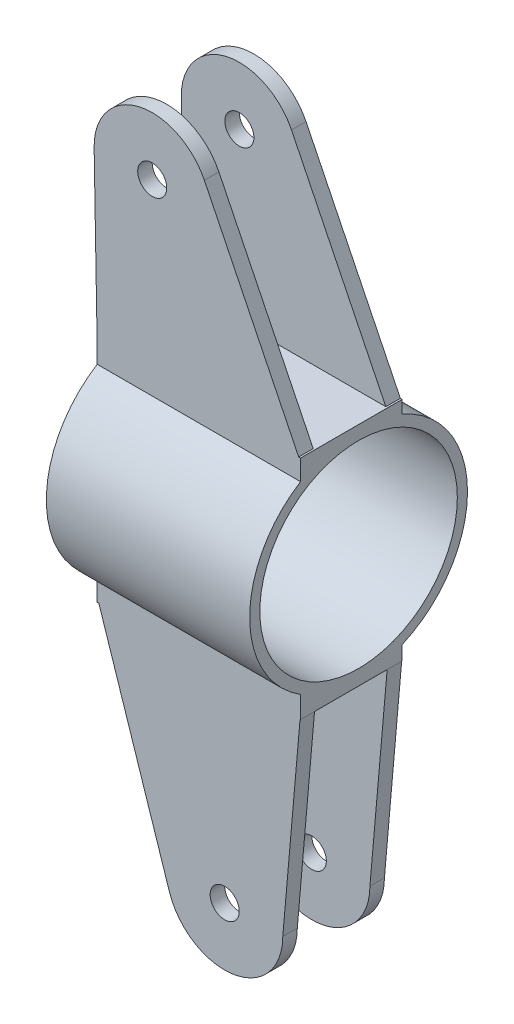
ISO-10303-21;
HEADER;
FILE_DESCRIPTION(('STEP AP214'),'2;1');
FILE_NAME('part.step','',(''),(''),'','','');
FILE_SCHEMA(('AUTOMOTIVE_DESIGN { 1 0 10303 214 1 1 1 1 }'));
ENDSEC;
DATA;
#1=APPLICATION_CONTEXT('core data for automotive mechanical design processes');
#2=APPLICATION_PROTOCOL_DEFINITION('international standard','automotive_design',2000,#1);
#3=PRODUCT_CONTEXT('',#1,'mechanical');
#4=PRODUCT('Part','Part','',(#3));
#5=PRODUCT_RELATED_PRODUCT_CATEGORY('part','',(#4));
#6=PRODUCT_DEFINITION_FORMATION('','',#4);
#7=PRODUCT_DEFINITION_CONTEXT('part definition',#1,'design');
#8=PRODUCT_DEFINITION('design','',#6,#7);
#9=PRODUCT_DEFINITION_SHAPE('','',#8);
#10=(LENGTH_UNIT() NAMED_UNIT(*) SI_UNIT(.MILLI.,.METRE.));
#11=(NAMED_UNIT(*) PLANE_ANGLE_UNIT() SI_UNIT($,.RADIAN.));
#12=(NAMED_UNIT(*) SI_UNIT($,.STERADIAN.) SOLID_ANGLE_UNIT());
#13=UNCERTAINTY_MEASURE_WITH_UNIT(LENGTH_MEASURE(1.E-05),#10,'distance_accuracy_value','');
#14=(GEOMETRIC_REPRESENTATION_CONTEXT(3) GLOBAL_UNCERTAINTY_ASSIGNED_CONTEXT((#13)) GLOBAL_UNIT_ASSIGNED_CONTEXT((#10,
#11,#12)) REPRESENTATION_CONTEXT('',''));
#15=CARTESIAN_POINT('',(0.,0.,0.));
#16=DIRECTION('',(0.,0.,1.));
#17=DIRECTION('',(1.,0.,0.));
#18=AXIS2_PLACEMENT_3D('',#15,#16,#17);
#19=CARTESIAN_POINT('',(70.796890518674,-39.2325936170341,-15.));
#20=DIRECTION('',(0.,-1.,0.));
#21=DIRECTION('',(0.,0.,-1.));
#22=AXIS2_PLACEMENT_3D('',#19,#20,#21);
#23=PLANE('',#22);
#24=DIRECTION('',(-1.,0.,0.));
#25=VECTOR('',#24,1.);
#26=CARTESIAN_POINT('',(70.796890518674,-39.2325936170341,-10.));
#27=LINE('',#26,#25);
#28=CARTESIAN_POINT('',(34.8477719876476,-39.2325936170341,-10.));
#29=VERTEX_POINT('',#28);
#30=CARTESIAN_POINT('',(-34.4302129102219,-39.2325936170341,-10.));
#31=VERTEX_POINT('',#30);
#32=EDGE_CURVE('E350',#29,#31,#27,.T.);
#33=ORIENTED_EDGE('',*,*,#32,.F.);
#34=DIRECTION('',(0.,0.,-1.));
#35=VECTOR('',#34,1.);
#36=CARTESIAN_POINT('',(34.8477719876476,-39.2325936170341,-15.));
#37=LINE('',#36,#35);
#38=CARTESIAN_POINT('',(34.8477719876476,-39.2325936170341,-15.));
#39=VERTEX_POINT('',#38);
#40=EDGE_CURVE('E347',#29,#39,#37,.T.);
#41=ORIENTED_EDGE('',*,*,#40,.T.);
#42=DIRECTION('',(-1.,0.,0.));
#43=VECTOR('',#42,1.);
#44=CARTESIAN_POINT('',(70.796890518674,-39.2325936170341,-15.));
#45=LINE('',#44,#43);
#46=CARTESIAN_POINT('',(35.,-39.2325936170341,-15.));
#47=VERTEX_POINT('',#46);
#48=EDGE_CURVE('E369',#47,#39,#45,.T.);
#49=ORIENTED_EDGE('',*,*,#48,.F.);
#50=DIRECTION('',(0.,0.,1.));
#51=VECTOR('',#50,1.);
#52=CARTESIAN_POINT('',(35.,-39.2325936170341,-15.));
#53=LINE('',#52,#51);
#54=CARTESIAN_POINT('',(35.,-39.2325936170341,20.));
#55=VERTEX_POINT('',#54);
#56=EDGE_CURVE('E366',#47,#55,#53,.T.);
#57=ORIENTED_EDGE('',*,*,#56,.T.);
#58=DIRECTION('',(-1.,0.,0.));
#59=VECTOR('',#58,1.);
#60=CARTESIAN_POINT('',(70.796890518674,-39.2325936170341,20.));
#61=LINE('',#60,#59);
#62=CARTESIAN_POINT('',(34.8477719876476,-39.2325936170341,20.));
#63=VERTEX_POINT('',#62);
#64=EDGE_CURVE('E365',#55,#63,#61,.T.);
#65=ORIENTED_EDGE('',*,*,#64,.T.);
#66=DIRECTION('',(0.,0.,1.));
#67=VECTOR('',#66,1.);
#68=CARTESIAN_POINT('',(34.8477719876476,-39.2325936170341,20.));
#69=LINE('',#68,#67);
#70=CARTESIAN_POINT('',(34.8477719876476,-39.2325936170341,15.));
#71=VERTEX_POINT('',#70);
#72=EDGE_CURVE('E381',#71,#63,#69,.T.);
#73=ORIENTED_EDGE('',*,*,#72,.F.);
#74=DIRECTION('',(1.,0.,0.));
#75=VECTOR('',#74,1.);
#76=CARTESIAN_POINT('',(8.89703954959997,-39.2325936170341,15.));
#77=LINE('',#76,#75);
#78=CARTESIAN_POINT('',(-34.4302129102219,-39.2325936170341,15.));
#79=VERTEX_POINT('',#78);
#80=EDGE_CURVE('E378',#79,#71,#77,.T.);
#81=ORIENTED_EDGE('',*,*,#80,.F.);
#82=DIRECTION('',(0.,0.,-1.));
#83=VECTOR('',#82,1.);
#84=CARTESIAN_POINT('',(-34.4302129102219,-39.2325936170341,20.));
#85=LINE('',#84,#83);
#86=CARTESIAN_POINT('',(-34.4302129102219,-39.2325936170341,20.));
#87=VERTEX_POINT('',#86);
#88=EDGE_CURVE('E11',#87,#79,#85,.T.);
#89=ORIENTED_EDGE('',*,*,#88,.F.);
#90=CARTESIAN_POINT('',(-35.,-39.2325936170341,20.));
#91=VERTEX_POINT('',#90);
#92=EDGE_CURVE('E62',#87,#91,#61,.T.);
#93=ORIENTED_EDGE('',*,*,#92,.T.);
#94=DIRECTION('',(0.,0.,1.));
#95=VECTOR('',#94,1.);
#96=CARTESIAN_POINT('',(-35.,-39.2325936170341,-15.));
#97=LINE('',#96,#95);
#98=CARTESIAN_POINT('',(-35.,-39.2325936170341,-15.));
#99=VERTEX_POINT('',#98);
#100=EDGE_CURVE('E356',#99,#91,#97,.T.);
#101=ORIENTED_EDGE('',*,*,#100,.F.);
#102=CARTESIAN_POINT('',(-34.4302129102219,-39.2325936170341,-15.));
#103=VERTEX_POINT('',#102);
#104=EDGE_CURVE('E361',#103,#99,#45,.T.);
#105=ORIENTED_EDGE('',*,*,#104,.F.);
#106=DIRECTION('',(0.,0.,1.));
#107=VECTOR('',#106,1.);
#108=CARTESIAN_POINT('',(-34.4302129102219,-39.2325936170341,-15.));
#109=LINE('',#108,#107);
#110=EDGE_CURVE('E344',#103,#31,#109,.T.);
#111=ORIENTED_EDGE('',*,*,#110,.T.);
#112=EDGE_LOOP('',(#33,#41,#49,#57,#65,#73,#81,#89,#93,#101,#105,#111));
#113=FACE_BOUND('',#112,.T.);
#114=ADVANCED_FACE('F39',(#113),#23,.T.);
#115=CARTESIAN_POINT('',(8.89703954959997,-106.961265098147,20.));
#116=DIRECTION('',(0.,0.,1.));
#117=DIRECTION('',(1.,0.,0.));
#118=AXIS2_PLACEMENT_3D('',#115,#116,#117);
#119=PLANE('',#118);
#120=DIRECTION('',(0.0875241718788062,0.996162396066489,0.));
#121=VECTOR('',#120,1.);
#122=CARTESIAN_POINT('',(35.,-37.5,20.));
#123=LINE('',#122,#121);
#124=CARTESIAN_POINT('',(28.8970395496,-106.961265098147,20.));
#125=VERTEX_POINT('',#124);
#126=EDGE_CURVE('E391',#125,#63,#123,.T.);
#127=ORIENTED_EDGE('',*,*,#126,.T.);
#128=ORIENTED_EDGE('',*,*,#64,.F.);
#129=DIRECTION('',(0.,1.,0.));
#130=VECTOR('',#129,1.);
#131=CARTESIAN_POINT('',(35.,-31.7214438511238,20.));
#132=LINE('',#131,#130);
#133=CARTESIAN_POINT('',(35.,-31.7214438511238,20.));
#134=VERTEX_POINT('',#133);
#135=EDGE_CURVE('E362',#55,#134,#132,.T.);
#136=ORIENTED_EDGE('',*,*,#135,.T.);
#137=DIRECTION('',(-1.,0.,0.));
#138=VECTOR('',#137,1.);
#139=CARTESIAN_POINT('',(70.796890518674,-31.7214438511238,20.));
#140=LINE('',#139,#138);
#141=CARTESIAN_POINT('',(-35.,-31.7214438511238,20.));
#142=VERTEX_POINT('',#141);
#143=EDGE_CURVE('E364',#134,#142,#140,.T.);
#144=ORIENTED_EDGE('',*,*,#143,.T.);
#145=DIRECTION('',(0.,1.,0.));
#146=VECTOR('',#145,1.);
#147=CARTESIAN_POINT('',(-35.,-31.7214438511238,20.));
#148=LINE('',#147,#146);
#149=EDGE_CURVE('E353',#91,#142,#148,.T.);
#150=ORIENTED_EDGE('',*,*,#149,.F.);
#151=ORIENTED_EDGE('',*,*,#92,.F.);
#152=DIRECTION('',(0.312403839167412,-0.949949388795773,0.));
#153=VECTOR('',#152,1.);
#154=CARTESIAN_POINT('',(-35.,-37.5,20.));
#155=LINE('',#154,#153);
#156=CARTESIAN_POINT('',(-10.1019482263155,-113.209341881495,20.));
#157=VERTEX_POINT('',#156);
#158=EDGE_CURVE('E394',#87,#157,#155,.T.);
#159=ORIENTED_EDGE('',*,*,#158,.T.);
#160=CARTESIAN_POINT('',(8.89703954959997,-106.961265098147,20.));
#161=DIRECTION('',(0.,0.,1.));
#162=DIRECTION('',(1.,0.,0.));
#163=AXIS2_PLACEMENT_3D('',#160,#161,#162);
#164=CIRCLE('',#163,20.);
#165=EDGE_CURVE('E397',#157,#125,#164,.T.);
#166=ORIENTED_EDGE('',*,*,#165,.T.);
#167=EDGE_LOOP('',(#127,#128,#136,#144,#150,#151,#159,#166));
#168=FACE_BOUND('',#167,.T.);
#169=CARTESIAN_POINT('',(8.89703954959997,-106.961265098147,20.));
#170=DIRECTION('',(0.,0.,1.));
#171=DIRECTION('',(1.,0.,0.));
#172=AXIS2_PLACEMENT_3D('',#169,#170,#171);
#173=CIRCLE('',#172,5.);
#174=CARTESIAN_POINT('',(13.8970395496,-106.961265098147,20.));
#175=VERTEX_POINT('',#174);
#176=EDGE_CURVE('E385',#175,#175,#173,.T.);
#177=ORIENTED_EDGE('',*,*,#176,.F.);
#178=EDGE_LOOP('',(#177));
#179=FACE_BOUND('',#178,.T.);
#180=ADVANCED_FACE('F423',(#168,#179),#119,.T.);
#181=CARTESIAN_POINT('',(8.89703954959997,-106.961265098147,15.));
#182=DIRECTION('',(0.,0.,1.));
#183=DIRECTION('',(1.,0.,0.));
#184=AXIS2_PLACEMENT_3D('',#181,#182,#183);
#185=PLANE('',#184);
#186=DIRECTION('',(0.312403839167412,-0.949949388795773,0.));
#187=VECTOR('',#186,1.);
#188=CARTESIAN_POINT('',(-35.,-37.5,15.));
#189=LINE('',#188,#187);
#190=CARTESIAN_POINT('',(-10.1019482263155,-113.209341881495,15.));
#191=VERTEX_POINT('',#190);
#192=EDGE_CURVE('E402',#79,#191,#189,.T.);
#193=ORIENTED_EDGE('',*,*,#192,.F.);
#194=ORIENTED_EDGE('',*,*,#80,.T.);
#195=DIRECTION('',(0.0875241718788062,0.996162396066489,0.));
#196=VECTOR('',#195,1.);
#197=CARTESIAN_POINT('',(35.,-37.5,15.));
#198=LINE('',#197,#196);
#199=CARTESIAN_POINT('',(28.8970395496,-106.961265098147,15.));
#200=VERTEX_POINT('',#199);
#201=EDGE_CURVE('E388',#200,#71,#198,.T.);
#202=ORIENTED_EDGE('',*,*,#201,.F.);
#203=CARTESIAN_POINT('',(8.89703954959997,-106.961265098147,15.));
#204=DIRECTION('',(0.,0.,1.));
#205=DIRECTION('',(1.,0.,0.));
#206=AXIS2_PLACEMENT_3D('',#203,#204,#205);
#207=CIRCLE('',#206,20.);
#208=EDGE_CURVE('E395',#191,#200,#207,.T.);
#209=ORIENTED_EDGE('',*,*,#208,.F.);
#210=EDGE_LOOP('',(#193,#194,#202,#209));
#211=FACE_BOUND('',#210,.T.);
#212=CARTESIAN_POINT('',(8.89703954959997,-106.961265098147,15.));
#213=DIRECTION('',(0.,0.,1.));
#214=DIRECTION('',(1.,0.,0.));
#215=AXIS2_PLACEMENT_3D('',#212,#213,#214);
#216=CIRCLE('',#215,5.);
#217=CARTESIAN_POINT('',(13.8970395496,-106.961265098147,15.));
#218=VERTEX_POINT('',#217);
#219=EDGE_CURVE('E384',#218,#218,#216,.T.);
#220=ORIENTED_EDGE('',*,*,#219,.T.);
#221=EDGE_LOOP('',(#220));
#222=FACE_BOUND('',#221,.T.);
#223=ADVANCED_FACE('F418',(#211,#222),#185,.F.);
#224=CARTESIAN_POINT('',(35.,-37.5,20.));
#225=DIRECTION('',(-0.996162396066489,0.0875241718788063,0.));
#226=DIRECTION('',(-0.0875241718788063,-0.996162396066489,0.));
#227=AXIS2_PLACEMENT_3D('',#224,#225,#226);
#228=PLANE('',#227);
#229=ORIENTED_EDGE('',*,*,#201,.T.);
#230=ORIENTED_EDGE('',*,*,#72,.T.);
#231=ORIENTED_EDGE('',*,*,#126,.F.);
#232=DIRECTION('',(0.,0.,-1.));
#233=VECTOR('',#232,1.);
#234=CARTESIAN_POINT('',(28.8970395496,-106.961265098147,20.));
#235=LINE('',#234,#233);
#236=EDGE_CURVE('E399',#125,#200,#235,.T.);
#237=ORIENTED_EDGE('',*,*,#236,.T.);
#238=EDGE_LOOP('',(#229,#230,#231,#237));
#239=FACE_BOUND('',#238,.T.);
#240=ADVANCED_FACE('F41',(#239),#228,.F.);
#241=CARTESIAN_POINT('',(-35.,-37.5,20.));
#242=DIRECTION('',(0.949949388795773,0.312403839167412,0.));
#243=DIRECTION('',(-0.312403839167412,0.949949388795773,0.));
#244=AXIS2_PLACEMENT_3D('',#241,#242,#243);
#245=PLANE('',#244);
#246=ORIENTED_EDGE('',*,*,#158,.F.);
#247=ORIENTED_EDGE('',*,*,#88,.T.);
#248=ORIENTED_EDGE('',*,*,#192,.T.);
#249=DIRECTION('',(0.,0.,-1.));
#250=VECTOR('',#249,1.);
#251=CARTESIAN_POINT('',(-10.1019482263155,-113.209341881495,20.));
#252=LINE('',#251,#250);
#253=EDGE_CURVE('E47',#157,#191,#252,.T.);
#254=ORIENTED_EDGE('',*,*,#253,.F.);
#255=EDGE_LOOP('',(#246,#247,#248,#254));
#256=FACE_BOUND('',#255,.T.);
#257=ADVANCED_FACE('F425',(#256),#245,.F.);
#258=CARTESIAN_POINT('',(8.89703954959997,-106.961265098147,20.));
#259=DIRECTION('',(0.,0.,-1.));
#260=DIRECTION('',(-1.,0.,0.));
#261=AXIS2_PLACEMENT_3D('',#258,#259,#260);
#262=CYLINDRICAL_SURFACE('',#261,20.);
#263=ORIENTED_EDGE('',*,*,#208,.T.);
#264=ORIENTED_EDGE('',*,*,#236,.F.);
#265=ORIENTED_EDGE('',*,*,#165,.F.);
#266=ORIENTED_EDGE('',*,*,#253,.T.);
#267=EDGE_LOOP('',(#263,#264,#265,#266));
#268=FACE_BOUND('',#267,.T.);
#269=ADVANCED_FACE('F411',(#268),#262,.T.);
#270=CARTESIAN_POINT('',(8.89703954959997,-106.961265098147,20.));
#271=DIRECTION('',(0.,0.,-1.));
#272=DIRECTION('',(-1.,0.,0.));
#273=AXIS2_PLACEMENT_3D('',#270,#271,#272);
#274=CYLINDRICAL_SURFACE('',#273,5.);
#275=ORIENTED_EDGE('',*,*,#176,.T.);
#276=EDGE_LOOP('',(#275));
#277=FACE_BOUND('',#276,.T.);
#278=ORIENTED_EDGE('',*,*,#219,.F.);
#279=EDGE_LOOP('',(#278));
#280=FACE_BOUND('',#279,.T.);
#281=ADVANCED_FACE('F519',(#277,#280),#274,.F.);
#282=CARTESIAN_POINT('',(35.,0.,0.));
#283=DIRECTION('',(1.,0.,0.));
#284=DIRECTION('',(0.,0.,-1.));
#285=AXIS2_PLACEMENT_3D('',#282,#283,#284);
#286=PLANE('',#285);
#287=ORIENTED_EDGE('',*,*,#56,.F.);
#288=DIRECTION('',(0.,-1.,0.));
#289=VECTOR('',#288,1.);
#290=CARTESIAN_POINT('',(35.,-34.3693177121688,-15.));
#291=LINE('',#290,#289);
#292=CARTESIAN_POINT('',(35.,-34.3693177121688,-15.));
#293=VERTEX_POINT('',#292);
#294=EDGE_CURVE('E355',#293,#47,#291,.T.);
#295=ORIENTED_EDGE('',*,*,#294,.F.);
#296=CARTESIAN_POINT('',(35.,0.,0.));
#297=DIRECTION('',(1.,0.,0.));
#298=DIRECTION('',(0.,0.,-1.));
#299=AXIS2_PLACEMENT_3D('',#296,#297,#298);
#300=CIRCLE('',#299,37.5);
#301=CARTESIAN_POINT('',(35.,34.3693177121688,-15.));
#302=VERTEX_POINT('',#301);
#303=EDGE_CURVE('E311',#293,#302,#300,.T.);
#304=ORIENTED_EDGE('',*,*,#303,.T.);
#305=DIRECTION('',(0.,1.,0.));
#306=VECTOR('',#305,1.);
#307=CARTESIAN_POINT('',(35.,37.5,-15.));
#308=LINE('',#307,#306);
#309=CARTESIAN_POINT('',(35.,38.7567278217142,-15.));
#310=VERTEX_POINT('',#309);
#311=EDGE_CURVE('E286',#302,#310,#308,.T.);
#312=ORIENTED_EDGE('',*,*,#311,.T.);
#313=DIRECTION('',(0.,0.,1.));
#314=VECTOR('',#313,1.);
#315=CARTESIAN_POINT('',(35.,38.7567278217142,20.));
#316=LINE('',#315,#314);
#317=CARTESIAN_POINT('',(35.,38.7567278217142,20.));
#318=VERTEX_POINT('',#317);
#319=EDGE_CURVE('E273',#310,#318,#316,.T.);
#320=ORIENTED_EDGE('',*,*,#319,.T.);
#321=DIRECTION('',(0.,-1.,0.));
#322=VECTOR('',#321,1.);
#323=CARTESIAN_POINT('',(35.,37.5,20.));
#324=LINE('',#323,#322);
#325=CARTESIAN_POINT('',(35.,31.7214438511238,20.));
#326=VERTEX_POINT('',#325);
#327=EDGE_CURVE('E284',#318,#326,#324,.T.);
#328=ORIENTED_EDGE('',*,*,#327,.T.);
#329=EDGE_CURVE('E307',#326,#134,#300,.T.);
#330=ORIENTED_EDGE('',*,*,#329,.T.);
#331=ORIENTED_EDGE('',*,*,#135,.F.);
#332=EDGE_LOOP('',(#287,#295,#304,#312,#320,#328,#330,#331));
#333=FACE_BOUND('',#332,.T.);
#334=CARTESIAN_POINT('',(35.,0.,0.));
#335=DIRECTION('',(1.,0.,0.));
#336=DIRECTION('',(0.,0.,-1.));
#337=AXIS2_PLACEMENT_3D('',#334,#335,#336);
#338=CIRCLE('',#337,34.);
#339=CARTESIAN_POINT('',(35.,0.,-34.));
#340=VERTEX_POINT('',#339);
#341=EDGE_CURVE('E301',#340,#340,#338,.T.);
#342=ORIENTED_EDGE('',*,*,#341,.F.);
#343=EDGE_LOOP('',(#342));
#344=FACE_BOUND('',#343,.T.);
#345=ADVANCED_FACE('F433',(#333,#344),#286,.T.);
#346=CARTESIAN_POINT('',(-35.,0.,0.));
#347=DIRECTION('',(-1.,0.,0.));
#348=DIRECTION('',(0.,0.,1.));
#349=AXIS2_PLACEMENT_3D('',#346,#347,#348);
#350=PLANE('',#349);
#351=DIRECTION('',(0.,-1.,0.));
#352=VECTOR('',#351,1.);
#353=CARTESIAN_POINT('',(-35.,-34.3693177121688,-15.));
#354=LINE('',#353,#352);
#355=CARTESIAN_POINT('',(-35.,-34.3693177121688,-15.));
#356=VERTEX_POINT('',#355);
#357=EDGE_CURVE('E352',#356,#99,#354,.T.);
#358=ORIENTED_EDGE('',*,*,#357,.T.);
#359=ORIENTED_EDGE('',*,*,#100,.T.);
#360=ORIENTED_EDGE('',*,*,#149,.T.);
#361=CARTESIAN_POINT('',(-35.,0.,0.));
#362=DIRECTION('',(1.,0.,0.));
#363=DIRECTION('',(0.,0.,-1.));
#364=AXIS2_PLACEMENT_3D('',#361,#362,#363);
#365=CIRCLE('',#364,37.5);
#366=CARTESIAN_POINT('',(-35.,31.7214438511238,20.));
#367=VERTEX_POINT('',#366);
#368=EDGE_CURVE('E312',#367,#142,#365,.T.);
#369=ORIENTED_EDGE('',*,*,#368,.F.);
#370=DIRECTION('',(0.,1.,0.));
#371=VECTOR('',#370,1.);
#372=CARTESIAN_POINT('',(-35.,37.5,20.));
#373=LINE('',#372,#371);
#374=CARTESIAN_POINT('',(-35.,37.5,20.));
#375=VERTEX_POINT('',#374);
#376=EDGE_CURVE('E274',#367,#375,#373,.T.);
#377=ORIENTED_EDGE('',*,*,#376,.T.);
#378=DIRECTION('',(0.,0.,-1.));
#379=VECTOR('',#378,1.);
#380=CARTESIAN_POINT('',(-35.,37.5,20.));
#381=LINE('',#380,#379);
#382=CARTESIAN_POINT('',(-35.,37.5,15.));
#383=VERTEX_POINT('',#382);
#384=EDGE_CURVE('E257',#375,#383,#381,.T.);
#385=ORIENTED_EDGE('',*,*,#384,.T.);
#386=DIRECTION('',(0.,-1.,0.));
#387=VECTOR('',#386,1.);
#388=CARTESIAN_POINT('',(-35.,0.,15.));
#389=LINE('',#388,#387);
#390=CARTESIAN_POINT('',(-35.,38.7567278217142,15.));
#391=VERTEX_POINT('',#390);
#392=EDGE_CURVE('E271',#391,#383,#389,.T.);
#393=ORIENTED_EDGE('',*,*,#392,.F.);
#394=DIRECTION('',(0.,0.,-1.));
#395=VECTOR('',#394,1.);
#396=CARTESIAN_POINT('',(-35.,38.7567278217142,20.));
#397=LINE('',#396,#395);
#398=CARTESIAN_POINT('',(-35.,38.7567278217142,-10.));
#399=VERTEX_POINT('',#398);
#400=EDGE_CURVE('E281',#391,#399,#397,.T.);
#401=ORIENTED_EDGE('',*,*,#400,.T.);
#402=DIRECTION('',(0.,-1.,0.));
#403=VECTOR('',#402,1.);
#404=CARTESIAN_POINT('',(-35.,0.,-10.));
#405=LINE('',#404,#403);
#406=CARTESIAN_POINT('',(-35.,37.5,-10.));
#407=VERTEX_POINT('',#406);
#408=EDGE_CURVE('E240',#399,#407,#405,.T.);
#409=ORIENTED_EDGE('',*,*,#408,.T.);
#410=DIRECTION('',(0.,0.,-1.));
#411=VECTOR('',#410,1.);
#412=CARTESIAN_POINT('',(-35.,37.5,-10.));
#413=LINE('',#412,#411);
#414=CARTESIAN_POINT('',(-35.,37.5,-15.));
#415=VERTEX_POINT('',#414);
#416=EDGE_CURVE('E226',#407,#415,#413,.T.);
#417=ORIENTED_EDGE('',*,*,#416,.T.);
#418=DIRECTION('',(0.,-1.,0.));
#419=VECTOR('',#418,1.);
#420=CARTESIAN_POINT('',(-35.,37.5,-15.));
#421=LINE('',#420,#419);
#422=CARTESIAN_POINT('',(-35.,34.3693177121688,-15.));
#423=VERTEX_POINT('',#422);
#424=EDGE_CURVE('E277',#415,#423,#421,.T.);
#425=ORIENTED_EDGE('',*,*,#424,.T.);
#426=EDGE_CURVE('E304',#356,#423,#365,.T.);
#427=ORIENTED_EDGE('',*,*,#426,.F.);
#428=EDGE_LOOP('',(#358,#359,#360,#369,#377,#385,#393,#401,#409,#417,#425,#427));
#429=FACE_BOUND('',#428,.T.);
#430=CARTESIAN_POINT('',(-35.,0.,0.));
#431=DIRECTION('',(1.,0.,0.));
#432=DIRECTION('',(0.,0.,-1.));
#433=AXIS2_PLACEMENT_3D('',#430,#431,#432);
#434=CIRCLE('',#433,34.);
#435=CARTESIAN_POINT('',(-35.,0.,-34.));
#436=VERTEX_POINT('',#435);
#437=EDGE_CURVE('E300',#436,#436,#434,.T.);
#438=ORIENTED_EDGE('',*,*,#437,.T.);
#439=EDGE_LOOP('',(#438));
#440=FACE_BOUND('',#439,.T.);
#441=ADVANCED_FACE('F443',(#429,#440),#350,.T.);
#442=CARTESIAN_POINT('',(70.796890518674,-34.3693177121688,-15.));
#443=DIRECTION('',(0.,0.,-1.));
#444=DIRECTION('',(-1.,0.,0.));
#445=AXIS2_PLACEMENT_3D('',#442,#443,#444);
#446=PLANE('',#445);
#447=ORIENTED_EDGE('',*,*,#294,.T.);
#448=ORIENTED_EDGE('',*,*,#48,.T.);
#449=DIRECTION('',(0.0875241718788062,0.996162396066489,0.));
#450=VECTOR('',#449,1.);
#451=CARTESIAN_POINT('',(35.,-37.5,-15.));
#452=LINE('',#451,#450);
#453=CARTESIAN_POINT('',(28.8970395496,-106.961265098147,-15.));
#454=VERTEX_POINT('',#453);
#455=EDGE_CURVE('E324',#454,#39,#452,.T.);
#456=ORIENTED_EDGE('',*,*,#455,.F.);
#457=CARTESIAN_POINT('',(8.89703954959997,-106.961265098147,-15.));
#458=DIRECTION('',(0.,0.,1.));
#459=DIRECTION('',(1.,0.,0.));
#460=AXIS2_PLACEMENT_3D('',#457,#458,#459);
#461=CIRCLE('',#460,20.);
#462=CARTESIAN_POINT('',(-10.1019482263155,-113.209341881495,-15.));
#463=VERTEX_POINT('',#462);
#464=EDGE_CURVE('E330',#463,#454,#461,.T.);
#465=ORIENTED_EDGE('',*,*,#464,.F.);
#466=DIRECTION('',(0.312403839167412,-0.949949388795773,0.));
#467=VECTOR('',#466,1.);
#468=CARTESIAN_POINT('',(-35.,-37.5,-15.));
#469=LINE('',#468,#467);
#470=EDGE_CURVE('E336',#103,#463,#469,.T.);
#471=ORIENTED_EDGE('',*,*,#470,.F.);
#472=ORIENTED_EDGE('',*,*,#104,.T.);
#473=ORIENTED_EDGE('',*,*,#357,.F.);
#474=DIRECTION('',(-1.,0.,0.));
#475=VECTOR('',#474,1.);
#476=CARTESIAN_POINT('',(70.796890518674,-34.3693177121688,-15.));
#477=LINE('',#476,#475);
#478=EDGE_CURVE('E372',#293,#356,#477,.T.);
#479=ORIENTED_EDGE('',*,*,#478,.F.);
#480=EDGE_LOOP('',(#447,#448,#456,#465,#471,#472,#473,#479));
#481=FACE_BOUND('',#480,.T.);
#482=CARTESIAN_POINT('',(8.89703954959997,-106.961265098147,-15.));
#483=DIRECTION('',(0.,0.,1.));
#484=DIRECTION('',(1.,0.,0.));
#485=AXIS2_PLACEMENT_3D('',#482,#483,#484);
#486=CIRCLE('',#485,5.);
#487=CARTESIAN_POINT('',(13.8970395496,-106.961265098147,-15.));
#488=VERTEX_POINT('',#487);
#489=EDGE_CURVE('E320',#488,#488,#486,.T.);
#490=ORIENTED_EDGE('',*,*,#489,.T.);
#491=EDGE_LOOP('',(#490));
#492=FACE_BOUND('',#491,.T.);
#493=ADVANCED_FACE('F450',(#481,#492),#446,.T.);
#494=CARTESIAN_POINT('',(8.89703954959997,-106.961265098147,-10.));
#495=DIRECTION('',(0.,0.,1.));
#496=DIRECTION('',(1.,0.,0.));
#497=AXIS2_PLACEMENT_3D('',#494,#495,#496);
#498=PLANE('',#497);
#499=DIRECTION('',(0.0875241718788062,0.996162396066489,0.));
#500=VECTOR('',#499,1.);
#501=CARTESIAN_POINT('',(35.,-37.5,-10.));
#502=LINE('',#501,#500);
#503=CARTESIAN_POINT('',(28.8970395496,-106.961265098147,-10.));
#504=VERTEX_POINT('',#503);
#505=EDGE_CURVE('E327',#504,#29,#502,.T.);
#506=ORIENTED_EDGE('',*,*,#505,.T.);
#507=ORIENTED_EDGE('',*,*,#32,.T.);
#508=DIRECTION('',(0.312403839167412,-0.949949388795773,0.));
#509=VECTOR('',#508,1.);
#510=CARTESIAN_POINT('',(-35.,-37.5,-10.));
#511=LINE('',#510,#509);
#512=CARTESIAN_POINT('',(-10.1019482263155,-113.209341881495,-10.));
#513=VERTEX_POINT('',#512);
#514=EDGE_CURVE('E54',#31,#513,#511,.T.);
#515=ORIENTED_EDGE('',*,*,#514,.T.);
#516=CARTESIAN_POINT('',(8.89703954959997,-106.961265098147,-10.));
#517=DIRECTION('',(0.,0.,1.));
#518=DIRECTION('',(1.,0.,0.));
#519=AXIS2_PLACEMENT_3D('',#516,#517,#518);
#520=CIRCLE('',#519,20.);
#521=EDGE_CURVE('E332',#513,#504,#520,.T.);
#522=ORIENTED_EDGE('',*,*,#521,.T.);
#523=EDGE_LOOP('',(#506,#507,#515,#522));
#524=FACE_BOUND('',#523,.T.);
#525=CARTESIAN_POINT('',(8.89703954959997,-106.961265098147,-10.));
#526=DIRECTION('',(0.,0.,1.));
#527=DIRECTION('',(1.,0.,0.));
#528=AXIS2_PLACEMENT_3D('',#525,#526,#527);
#529=CIRCLE('',#528,5.);
#530=CARTESIAN_POINT('',(13.8970395496,-106.961265098147,-10.));
#531=VERTEX_POINT('',#530);
#532=EDGE_CURVE('E321',#531,#531,#529,.T.);
#533=ORIENTED_EDGE('',*,*,#532,.F.);
#534=EDGE_LOOP('',(#533));
#535=FACE_BOUND('',#534,.T.);
#536=ADVANCED_FACE('F461',(#524,#535),#498,.T.);
#537=CARTESIAN_POINT('',(35.,-37.5,-10.));
#538=DIRECTION('',(-0.996162396066489,0.0875241718788063,0.));
#539=DIRECTION('',(-0.0875241718788063,-0.996162396066489,0.));
#540=AXIS2_PLACEMENT_3D('',#537,#538,#539);
#541=PLANE('',#540);
#542=ORIENTED_EDGE('',*,*,#40,.F.);
#543=ORIENTED_EDGE('',*,*,#505,.F.);
#544=DIRECTION('',(0.,0.,-1.));
#545=VECTOR('',#544,1.);
#546=CARTESIAN_POINT('',(28.8970395496,-106.961265098147,-10.));
#547=LINE('',#546,#545);
#548=EDGE_CURVE('E334',#504,#454,#547,.T.);
#549=ORIENTED_EDGE('',*,*,#548,.T.);
#550=ORIENTED_EDGE('',*,*,#455,.T.);
#551=EDGE_LOOP('',(#542,#543,#549,#550));
#552=FACE_BOUND('',#551,.T.);
#553=ADVANCED_FACE('F598',(#552),#541,.F.);
#554=CARTESIAN_POINT('',(-35.,-37.5,-10.));
#555=DIRECTION('',(0.949949388795773,0.312403839167412,0.));
#556=DIRECTION('',(-0.312403839167412,0.949949388795773,0.));
#557=AXIS2_PLACEMENT_3D('',#554,#555,#556);
#558=PLANE('',#557);
#559=ORIENTED_EDGE('',*,*,#110,.F.);
#560=ORIENTED_EDGE('',*,*,#470,.T.);
#561=DIRECTION('',(0.,0.,-1.));
#562=VECTOR('',#561,1.);
#563=CARTESIAN_POINT('',(-10.1019482263155,-113.209341881495,-10.));
#564=LINE('',#563,#562);
#565=EDGE_CURVE('E341',#513,#463,#564,.T.);
#566=ORIENTED_EDGE('',*,*,#565,.F.);
#567=ORIENTED_EDGE('',*,*,#514,.F.);
#568=EDGE_LOOP('',(#559,#560,#566,#567));
#569=FACE_BOUND('',#568,.T.);
#570=ADVANCED_FACE('F454',(#569),#558,.F.);
#571=CARTESIAN_POINT('',(8.89703954959997,-106.961265098147,-10.));
#572=DIRECTION('',(0.,0.,-1.));
#573=DIRECTION('',(-1.,0.,0.));
#574=AXIS2_PLACEMENT_3D('',#571,#572,#573);
#575=CYLINDRICAL_SURFACE('',#574,20.);
#576=ORIENTED_EDGE('',*,*,#464,.T.);
#577=ORIENTED_EDGE('',*,*,#548,.F.);
#578=ORIENTED_EDGE('',*,*,#521,.F.);
#579=ORIENTED_EDGE('',*,*,#565,.T.);
#580=EDGE_LOOP('',(#576,#577,#578,#579));
#581=FACE_BOUND('',#580,.T.);
#582=ADVANCED_FACE('F457',(#581),#575,.T.);
#583=CARTESIAN_POINT('',(8.89703954959997,-106.961265098147,-10.));
#584=DIRECTION('',(0.,0.,-1.));
#585=DIRECTION('',(-1.,0.,0.));
#586=AXIS2_PLACEMENT_3D('',#583,#584,#585);
#587=CYLINDRICAL_SURFACE('',#586,5.);
#588=ORIENTED_EDGE('',*,*,#532,.T.);
#589=EDGE_LOOP('',(#588));
#590=FACE_BOUND('',#589,.T.);
#591=ORIENTED_EDGE('',*,*,#489,.F.);
#592=EDGE_LOOP('',(#591));
#593=FACE_BOUND('',#592,.T.);
#594=ADVANCED_FACE('F622',(#590,#593),#587,.F.);
#595=CARTESIAN_POINT('',(35.,0.,0.));
#596=DIRECTION('',(-1.,0.,0.));
#597=DIRECTION('',(0.,0.,1.));
#598=AXIS2_PLACEMENT_3D('',#595,#596,#597);
#599=CYLINDRICAL_SURFACE('',#598,37.5);
#600=ORIENTED_EDGE('',*,*,#143,.F.);
#601=ORIENTED_EDGE('',*,*,#329,.F.);
#602=DIRECTION('',(1.,0.,0.));
#603=VECTOR('',#602,1.);
#604=CARTESIAN_POINT('',(-70.7000731168277,31.7214438511238,20.));
#605=LINE('',#604,#603);
#606=EDGE_CURVE('E291',#367,#326,#605,.T.);
#607=ORIENTED_EDGE('',*,*,#606,.F.);
#608=ORIENTED_EDGE('',*,*,#368,.T.);
#609=EDGE_LOOP('',(#600,#601,#607,#608));
#610=FACE_BOUND('',#609,.T.);
#611=ADVANCED_FACE('F439',(#610),#599,.T.);
#612=CARTESIAN_POINT('',(-70.7000731168277,38.7567278217142,20.));
#613=DIRECTION('',(0.,1.,0.));
#614=DIRECTION('',(0.,0.,1.));
#615=AXIS2_PLACEMENT_3D('',#612,#613,#614);
#616=PLANE('',#615);
#617=DIRECTION('',(1.,0.,0.));
#618=VECTOR('',#617,1.);
#619=CARTESIAN_POINT('',(-70.7000731168277,38.7567278217142,-10.));
#620=LINE('',#619,#618);
#621=CARTESIAN_POINT('',(34.3841582596329,38.7567278217142,-10.));
#622=VERTEX_POINT('',#621);
#623=EDGE_CURVE('E206',#399,#622,#620,.T.);
#624=ORIENTED_EDGE('',*,*,#623,.F.);
#625=ORIENTED_EDGE('',*,*,#400,.F.);
#626=DIRECTION('',(1.,0.,0.));
#627=VECTOR('',#626,1.);
#628=CARTESIAN_POINT('',(-70.7000731168277,38.7567278217142,15.));
#629=LINE('',#628,#627);
#630=CARTESIAN_POINT('',(34.3841582596329,38.7567278217143,15.));
#631=VERTEX_POINT('',#630);
#632=EDGE_CURVE('E317',#391,#631,#629,.T.);
#633=ORIENTED_EDGE('',*,*,#632,.T.);
#634=DIRECTION('',(0.,0.,1.));
#635=VECTOR('',#634,1.);
#636=CARTESIAN_POINT('',(34.3841582596329,38.7567278217142,20.));
#637=LINE('',#636,#635);
#638=CARTESIAN_POINT('',(34.3841582596329,38.7567278217142,20.));
#639=VERTEX_POINT('',#638);
#640=EDGE_CURVE('E310',#631,#639,#637,.T.);
#641=ORIENTED_EDGE('',*,*,#640,.T.);
#642=DIRECTION('',(1.,0.,0.));
#643=VECTOR('',#642,1.);
#644=CARTESIAN_POINT('',(-70.7000731168277,38.7567278217142,20.));
#645=LINE('',#644,#643);
#646=EDGE_CURVE('E294',#639,#318,#645,.T.);
#647=ORIENTED_EDGE('',*,*,#646,.T.);
#648=ORIENTED_EDGE('',*,*,#319,.F.);
#649=DIRECTION('',(1.,0.,0.));
#650=VECTOR('',#649,1.);
#651=CARTESIAN_POINT('',(-70.7000731168277,38.7567278217142,-15.));
#652=LINE('',#651,#650);
#653=CARTESIAN_POINT('',(34.3841582596329,38.7567278217142,-15.));
#654=VERTEX_POINT('',#653);
#655=EDGE_CURVE('E288',#654,#310,#652,.T.);
#656=ORIENTED_EDGE('',*,*,#655,.F.);
#657=DIRECTION('',(0.,0.,1.));
#658=VECTOR('',#657,1.);
#659=CARTESIAN_POINT('',(34.3841582596329,38.7567278217142,20.));
#660=LINE('',#659,#658);
#661=EDGE_CURVE('E218',#654,#622,#660,.T.);
#662=ORIENTED_EDGE('',*,*,#661,.T.);
#663=EDGE_LOOP('',(#624,#625,#633,#641,#647,#648,#656,#662));
#664=FACE_BOUND('',#663,.T.);
#665=ADVANCED_FACE('F478',(#664),#616,.T.);
#666=ORIENTED_EDGE('',*,*,#478,.T.);
#667=ORIENTED_EDGE('',*,*,#426,.T.);
#668=DIRECTION('',(1.,0.,0.));
#669=VECTOR('',#668,1.);
#670=CARTESIAN_POINT('',(-70.7000731168277,34.3693177121688,-15.));
#671=LINE('',#670,#669);
#672=EDGE_CURVE('E278',#423,#302,#671,.T.);
#673=ORIENTED_EDGE('',*,*,#672,.T.);
#674=ORIENTED_EDGE('',*,*,#303,.F.);
#675=EDGE_LOOP('',(#666,#667,#673,#674));
#676=FACE_BOUND('',#675,.T.);
#677=ADVANCED_FACE('F465',(#676),#599,.T.);
#678=CARTESIAN_POINT('',(35.,0.,0.));
#679=DIRECTION('',(-1.,0.,0.));
#680=DIRECTION('',(0.,0.,1.));
#681=AXIS2_PLACEMENT_3D('',#678,#679,#680);
#682=CYLINDRICAL_SURFACE('',#681,34.);
#683=ORIENTED_EDGE('',*,*,#341,.T.);
#684=EDGE_LOOP('',(#683));
#685=FACE_BOUND('',#684,.T.);
#686=ORIENTED_EDGE('',*,*,#437,.F.);
#687=EDGE_LOOP('',(#686));
#688=FACE_BOUND('',#687,.T.);
#689=ADVANCED_FACE('F656',(#685,#688),#682,.F.);
#690=CARTESIAN_POINT('',(-70.7000731168277,37.5,-15.));
#691=DIRECTION('',(0.,0.,-1.));
#692=DIRECTION('',(-1.,0.,0.));
#693=AXIS2_PLACEMENT_3D('',#690,#691,#692);
#694=PLANE('',#693);
#695=ORIENTED_EDGE('',*,*,#424,.F.);
#696=DIRECTION('',(0.0179202730644484,-0.999839419013521,0.));
#697=VECTOR('',#696,1.);
#698=CARTESIAN_POINT('',(-36.0463605021363,95.8803869936669,-15.));
#699=LINE('',#698,#697);
#700=CARTESIAN_POINT('',(-36.0463605021363,95.8803869936669,-15.));
#701=VERTEX_POINT('',#700);
#702=EDGE_CURVE('E209',#701,#415,#699,.T.);
#703=ORIENTED_EDGE('',*,*,#702,.F.);
#704=CARTESIAN_POINT('',(-16.0527832258704,96.2387349018534,-15.));
#705=DIRECTION('',(0.,0.,1.));
#706=DIRECTION('',(1.,0.,0.));
#707=AXIS2_PLACEMENT_3D('',#704,#705,#706);
#708=CIRCLE('',#707,19.9967883802704);
#709=CARTESIAN_POINT('',(1.90425986018726,105.037379634469,-15.));
#710=VERTEX_POINT('',#709);
#711=EDGE_CURVE('E231',#710,#701,#708,.T.);
#712=ORIENTED_EDGE('',*,*,#711,.F.);
#713=DIRECTION('',(-0.440041238319685,0.897977565743197,0.));
#714=VECTOR('',#713,1.);
#715=CARTESIAN_POINT('',(1.90425986018726,105.037379634469,-15.));
#716=LINE('',#715,#714);
#717=EDGE_CURVE('E215',#654,#710,#716,.T.);
#718=ORIENTED_EDGE('',*,*,#717,.F.);
#719=ORIENTED_EDGE('',*,*,#655,.T.);
#720=ORIENTED_EDGE('',*,*,#311,.F.);
#721=ORIENTED_EDGE('',*,*,#672,.F.);
#722=EDGE_LOOP('',(#695,#703,#712,#718,#719,#720,#721));
#723=FACE_BOUND('',#722,.T.);
#724=CARTESIAN_POINT('',(-16.0527832258704,96.2387349018534,-15.));
#725=DIRECTION('',(0.,0.,1.));
#726=DIRECTION('',(1.,0.,0.));
#727=AXIS2_PLACEMENT_3D('',#724,#725,#726);
#728=CIRCLE('',#727,5.);
#729=CARTESIAN_POINT('',(-11.0527832258704,96.2387349018534,-15.));
#730=VERTEX_POINT('',#729);
#731=EDGE_CURVE('E780',#730,#730,#728,.T.);
#732=ORIENTED_EDGE('',*,*,#731,.T.);
#733=EDGE_LOOP('',(#732));
#734=FACE_BOUND('',#733,.T.);
#735=ADVANCED_FACE('F472',(#723,#734),#694,.T.);
#736=CARTESIAN_POINT('',(-70.7000731168277,37.5,20.));
#737=DIRECTION('',(0.,0.,1.));
#738=DIRECTION('',(1.,0.,0.));
#739=AXIS2_PLACEMENT_3D('',#736,#737,#738);
#740=PLANE('',#739);
#741=DIRECTION('',(0.0179202730644484,-0.999839419013521,0.));
#742=VECTOR('',#741,1.);
#743=CARTESIAN_POINT('',(-36.0463605021363,95.8803869936669,20.));
#744=LINE('',#743,#742);
#745=CARTESIAN_POINT('',(-36.0463605021363,95.8803869936669,20.));
#746=VERTEX_POINT('',#745);
#747=EDGE_CURVE('E255',#746,#375,#744,.T.);
#748=ORIENTED_EDGE('',*,*,#747,.T.);
#749=ORIENTED_EDGE('',*,*,#376,.F.);
#750=ORIENTED_EDGE('',*,*,#606,.T.);
#751=ORIENTED_EDGE('',*,*,#327,.F.);
#752=ORIENTED_EDGE('',*,*,#646,.F.);
#753=DIRECTION('',(-0.440041238319685,0.897977565743197,0.));
#754=VECTOR('',#753,1.);
#755=CARTESIAN_POINT('',(1.90425986018726,105.037379634469,20.));
#756=LINE('',#755,#754);
#757=CARTESIAN_POINT('',(1.90425986018726,105.037379634469,20.));
#758=VERTEX_POINT('',#757);
#759=EDGE_CURVE('E250',#639,#758,#756,.T.);
#760=ORIENTED_EDGE('',*,*,#759,.T.);
#761=CARTESIAN_POINT('',(-16.0527832258704,96.2387349018534,20.));
#762=DIRECTION('',(0.,0.,1.));
#763=DIRECTION('',(1.,0.,0.));
#764=AXIS2_PLACEMENT_3D('',#761,#762,#763);
#765=CIRCLE('',#764,19.9967883802704);
#766=EDGE_CURVE('E252',#758,#746,#765,.T.);
#767=ORIENTED_EDGE('',*,*,#766,.T.);
#768=EDGE_LOOP('',(#748,#749,#750,#751,#752,#760,#767));
#769=FACE_BOUND('',#768,.T.);
#770=CARTESIAN_POINT('',(-16.0527832258704,96.2387349018534,20.));
#771=DIRECTION('',(0.,0.,1.));
#772=DIRECTION('',(1.,0.,0.));
#773=AXIS2_PLACEMENT_3D('',#770,#771,#772);
#774=CIRCLE('',#773,5.);
#775=CARTESIAN_POINT('',(-11.0527832258704,96.2387349018534,20.));
#776=VERTEX_POINT('',#775);
#777=EDGE_CURVE('E244',#776,#776,#774,.T.);
#778=ORIENTED_EDGE('',*,*,#777,.F.);
#779=EDGE_LOOP('',(#778));
#780=FACE_BOUND('',#779,.T.);
#781=ADVANCED_FACE('F481',(#769,#780),#740,.T.);
#782=CARTESIAN_POINT('',(-16.0527832258704,96.2387349018534,15.));
#783=DIRECTION('',(0.,0.,1.));
#784=DIRECTION('',(1.,0.,0.));
#785=AXIS2_PLACEMENT_3D('',#782,#783,#784);
#786=PLANE('',#785);
#787=CARTESIAN_POINT('',(-16.0527832258704,96.2387349018534,15.));
#788=DIRECTION('',(0.,0.,1.));
#789=DIRECTION('',(1.,0.,0.));
#790=AXIS2_PLACEMENT_3D('',#787,#788,#789);
#791=CIRCLE('',#790,5.);
#792=CARTESIAN_POINT('',(-11.0527832258704,96.2387349018534,15.));
#793=VERTEX_POINT('',#792);
#794=EDGE_CURVE('E243',#793,#793,#791,.T.);
#795=ORIENTED_EDGE('',*,*,#794,.T.);
#796=EDGE_LOOP('',(#795));
#797=FACE_BOUND('',#796,.T.);
#798=ORIENTED_EDGE('',*,*,#632,.F.);
#799=ORIENTED_EDGE('',*,*,#392,.T.);
#800=DIRECTION('',(0.0179202730644484,-0.999839419013521,0.));
#801=VECTOR('',#800,1.);
#802=CARTESIAN_POINT('',(-36.0463605021363,95.8803869936669,15.));
#803=LINE('',#802,#801);
#804=CARTESIAN_POINT('',(-36.0463605021363,95.8803869936669,15.));
#805=VERTEX_POINT('',#804);
#806=EDGE_CURVE('E253',#805,#383,#803,.T.);
#807=ORIENTED_EDGE('',*,*,#806,.F.);
#808=CARTESIAN_POINT('',(-16.0527832258704,96.2387349018534,15.));
#809=DIRECTION('',(0.,0.,1.));
#810=DIRECTION('',(1.,0.,0.));
#811=AXIS2_PLACEMENT_3D('',#808,#809,#810);
#812=CIRCLE('',#811,19.9967883802704);
#813=CARTESIAN_POINT('',(1.90425986018726,105.037379634469,15.));
#814=VERTEX_POINT('',#813);
#815=EDGE_CURVE('E259',#814,#805,#812,.T.);
#816=ORIENTED_EDGE('',*,*,#815,.F.);
#817=DIRECTION('',(-0.440041238319685,0.897977565743197,0.));
#818=VECTOR('',#817,1.);
#819=CARTESIAN_POINT('',(1.90425986018726,105.037379634469,15.));
#820=LINE('',#819,#818);
#821=EDGE_CURVE('E247',#631,#814,#820,.T.);
#822=ORIENTED_EDGE('',*,*,#821,.F.);
#823=EDGE_LOOP('',(#798,#799,#807,#816,#822));
#824=FACE_BOUND('',#823,.T.);
#825=ADVANCED_FACE('F682',(#797,#824),#786,.F.);
#826=CARTESIAN_POINT('',(1.90425986018726,105.037379634469,20.));
#827=DIRECTION('',(-0.897977565743197,-0.440041238319685,0.));
#828=DIRECTION('',(0.440041238319685,-0.897977565743197,0.));
#829=AXIS2_PLACEMENT_3D('',#826,#827,#828);
#830=PLANE('',#829);
#831=ORIENTED_EDGE('',*,*,#640,.F.);
#832=ORIENTED_EDGE('',*,*,#821,.T.);
#833=DIRECTION('',(0.,0.,-1.));
#834=VECTOR('',#833,1.);
#835=CARTESIAN_POINT('',(1.90425986018726,105.037379634469,20.));
#836=LINE('',#835,#834);
#837=EDGE_CURVE('E268',#758,#814,#836,.T.);
#838=ORIENTED_EDGE('',*,*,#837,.F.);
#839=ORIENTED_EDGE('',*,*,#759,.F.);
#840=EDGE_LOOP('',(#831,#832,#838,#839));
#841=FACE_BOUND('',#840,.T.);
#842=ADVANCED_FACE('F693',(#841),#830,.F.);
#843=CARTESIAN_POINT('',(-16.0527832258704,96.2387349018534,20.));
#844=DIRECTION('',(0.,0.,-1.));
#845=DIRECTION('',(-1.,0.,0.));
#846=AXIS2_PLACEMENT_3D('',#843,#844,#845);
#847=CYLINDRICAL_SURFACE('',#846,19.9967883802704);
#848=ORIENTED_EDGE('',*,*,#815,.T.);
#849=DIRECTION('',(0.,0.,-1.));
#850=VECTOR('',#849,1.);
#851=CARTESIAN_POINT('',(-36.0463605021363,95.8803869936669,20.));
#852=LINE('',#851,#850);
#853=EDGE_CURVE('E265',#746,#805,#852,.T.);
#854=ORIENTED_EDGE('',*,*,#853,.F.);
#855=ORIENTED_EDGE('',*,*,#766,.F.);
#856=ORIENTED_EDGE('',*,*,#837,.T.);
#857=EDGE_LOOP('',(#848,#854,#855,#856));
#858=FACE_BOUND('',#857,.T.);
#859=ADVANCED_FACE('F704',(#858),#847,.T.);
#860=CARTESIAN_POINT('',(-36.0463605021363,95.8803869936669,20.));
#861=DIRECTION('',(0.999839419013521,0.0179202730644484,0.));
#862=DIRECTION('',(-0.0179202730644484,0.999839419013521,0.));
#863=AXIS2_PLACEMENT_3D('',#860,#861,#862);
#864=PLANE('',#863);
#865=ORIENTED_EDGE('',*,*,#806,.T.);
#866=ORIENTED_EDGE('',*,*,#384,.F.);
#867=ORIENTED_EDGE('',*,*,#747,.F.);
#868=ORIENTED_EDGE('',*,*,#853,.T.);
#869=EDGE_LOOP('',(#865,#866,#867,#868));
#870=FACE_BOUND('',#869,.T.);
#871=ADVANCED_FACE('F488',(#870),#864,.F.);
#872=CARTESIAN_POINT('',(-16.0527832258704,96.2387349018534,20.));
#873=DIRECTION('',(0.,0.,-1.));
#874=DIRECTION('',(-1.,0.,0.));
#875=AXIS2_PLACEMENT_3D('',#872,#873,#874);
#876=CYLINDRICAL_SURFACE('',#875,5.);
#877=ORIENTED_EDGE('',*,*,#777,.T.);
#878=EDGE_LOOP('',(#877));
#879=FACE_BOUND('',#878,.T.);
#880=ORIENTED_EDGE('',*,*,#794,.F.);
#881=EDGE_LOOP('',(#880));
#882=FACE_BOUND('',#881,.T.);
#883=ADVANCED_FACE('F723',(#879,#882),#876,.F.);
#884=CARTESIAN_POINT('',(-16.0527832258704,96.2387349018534,-10.));
#885=DIRECTION('',(0.,0.,1.));
#886=DIRECTION('',(1.,0.,0.));
#887=AXIS2_PLACEMENT_3D('',#884,#885,#886);
#888=PLANE('',#887);
#889=CARTESIAN_POINT('',(-16.0527832258704,96.2387349018534,-10.));
#890=DIRECTION('',(0.,0.,1.));
#891=DIRECTION('',(1.,0.,0.));
#892=AXIS2_PLACEMENT_3D('',#889,#890,#891);
#893=CIRCLE('',#892,5.);
#894=CARTESIAN_POINT('',(-11.0527832258704,96.2387349018534,-10.));
#895=VERTEX_POINT('',#894);
#896=EDGE_CURVE('E232',#895,#895,#893,.T.);
#897=ORIENTED_EDGE('',*,*,#896,.F.);
#898=EDGE_LOOP('',(#897));
#899=FACE_BOUND('',#898,.T.);
#900=ORIENTED_EDGE('',*,*,#408,.F.);
#901=ORIENTED_EDGE('',*,*,#623,.T.);
#902=DIRECTION('',(-0.440041238319685,0.897977565743197,0.));
#903=VECTOR('',#902,1.);
#904=CARTESIAN_POINT('',(1.90425986018726,105.037379634469,-10.));
#905=LINE('',#904,#903);
#906=CARTESIAN_POINT('',(1.90425986018726,105.037379634469,-10.));
#907=VERTEX_POINT('',#906);
#908=EDGE_CURVE('E199',#622,#907,#905,.T.);
#909=ORIENTED_EDGE('',*,*,#908,.T.);
#910=CARTESIAN_POINT('',(-16.0527832258704,96.2387349018534,-10.));
#911=DIRECTION('',(0.,0.,1.));
#912=DIRECTION('',(1.,0.,0.));
#913=AXIS2_PLACEMENT_3D('',#910,#911,#912);
#914=CIRCLE('',#913,19.9967883802704);
#915=CARTESIAN_POINT('',(-36.0463605021363,95.8803869936669,-10.));
#916=VERTEX_POINT('',#915);
#917=EDGE_CURVE('E203',#907,#916,#914,.T.);
#918=ORIENTED_EDGE('',*,*,#917,.T.);
#919=DIRECTION('',(0.0179202730644484,-0.999839419013521,0.));
#920=VECTOR('',#919,1.);
#921=CARTESIAN_POINT('',(-36.0463605021363,95.8803869936669,-10.));
#922=LINE('',#921,#920);
#923=EDGE_CURVE('E224',#916,#407,#922,.T.);
#924=ORIENTED_EDGE('',*,*,#923,.T.);
#925=EDGE_LOOP('',(#900,#901,#909,#918,#924));
#926=FACE_BOUND('',#925,.T.);
#927=ADVANCED_FACE('F201',(#899,#926),#888,.T.);
#928=CARTESIAN_POINT('',(1.90425986018726,105.037379634469,-10.));
#929=DIRECTION('',(-0.897977565743197,-0.440041238319685,0.));
#930=DIRECTION('',(0.440041238319685,-0.897977565743197,0.));
#931=AXIS2_PLACEMENT_3D('',#928,#929,#930);
#932=PLANE('',#931);
#933=ORIENTED_EDGE('',*,*,#661,.F.);
#934=ORIENTED_EDGE('',*,*,#717,.T.);
#935=DIRECTION('',(0.,0.,-1.));
#936=VECTOR('',#935,1.);
#937=CARTESIAN_POINT('',(1.90425986018726,105.037379634469,-10.));
#938=LINE('',#937,#936);
#939=EDGE_CURVE('E212',#907,#710,#938,.T.);
#940=ORIENTED_EDGE('',*,*,#939,.F.);
#941=ORIENTED_EDGE('',*,*,#908,.F.);
#942=EDGE_LOOP('',(#933,#934,#940,#941));
#943=FACE_BOUND('',#942,.T.);
#944=ADVANCED_FACE('F213',(#943),#932,.F.);
#945=CARTESIAN_POINT('',(-16.0527832258704,96.2387349018534,-10.));
#946=DIRECTION('',(0.,0.,-1.));
#947=DIRECTION('',(-1.,0.,0.));
#948=AXIS2_PLACEMENT_3D('',#945,#946,#947);
#949=CYLINDRICAL_SURFACE('',#948,19.9967883802704);
#950=ORIENTED_EDGE('',*,*,#711,.T.);
#951=DIRECTION('',(0.,0.,-1.));
#952=VECTOR('',#951,1.);
#953=CARTESIAN_POINT('',(-36.0463605021363,95.8803869936669,-10.));
#954=LINE('',#953,#952);
#955=EDGE_CURVE('E219',#916,#701,#954,.T.);
#956=ORIENTED_EDGE('',*,*,#955,.F.);
#957=ORIENTED_EDGE('',*,*,#917,.F.);
#958=ORIENTED_EDGE('',*,*,#939,.T.);
#959=EDGE_LOOP('',(#950,#956,#957,#958));
#960=FACE_BOUND('',#959,.T.);
#961=ADVANCED_FACE('F221',(#960),#949,.T.);
#962=CARTESIAN_POINT('',(-36.0463605021363,95.8803869936669,-10.));
#963=DIRECTION('',(0.999839419013521,0.0179202730644484,0.));
#964=DIRECTION('',(-0.0179202730644484,0.999839419013521,0.));
#965=AXIS2_PLACEMENT_3D('',#962,#963,#964);
#966=PLANE('',#965);
#967=ORIENTED_EDGE('',*,*,#702,.T.);
#968=ORIENTED_EDGE('',*,*,#416,.F.);
#969=ORIENTED_EDGE('',*,*,#923,.F.);
#970=ORIENTED_EDGE('',*,*,#955,.T.);
#971=EDGE_LOOP('',(#967,#968,#969,#970));
#972=FACE_BOUND('',#971,.T.);
#973=ADVANCED_FACE('F494',(#972),#966,.F.);
#974=CARTESIAN_POINT('',(-16.0527832258704,96.2387349018534,-10.));
#975=DIRECTION('',(0.,0.,-1.));
#976=DIRECTION('',(-1.,0.,0.));
#977=AXIS2_PLACEMENT_3D('',#974,#975,#976);
#978=CYLINDRICAL_SURFACE('',#977,5.);
#979=ORIENTED_EDGE('',*,*,#896,.T.);
#980=EDGE_LOOP('',(#979));
#981=FACE_BOUND('',#980,.T.);
#982=ORIENTED_EDGE('',*,*,#731,.F.);
#983=EDGE_LOOP('',(#982));
#984=FACE_BOUND('',#983,.T.);
#985=ADVANCED_FACE('F496',(#981,#984),#978,.F.);
#986=CLOSED_SHELL('',(#114,#180,#223,#240,#257,#269,#281,#345,#441,#493,#536,#553,#570,#582,
#594,#611,#665,#677,#689,#735,#781,#825,#842,#859,#871,#883,#927,#944,#961,#973,#985));
#987=MANIFOLD_SOLID_BREP('B2',#986);
#988=ADVANCED_BREP_SHAPE_REPRESENTATION('',(#18,#987),#14);
#989=SHAPE_DEFINITION_REPRESENTATION(#9,#988);
ENDSEC;
END-ISO-10303-21;
